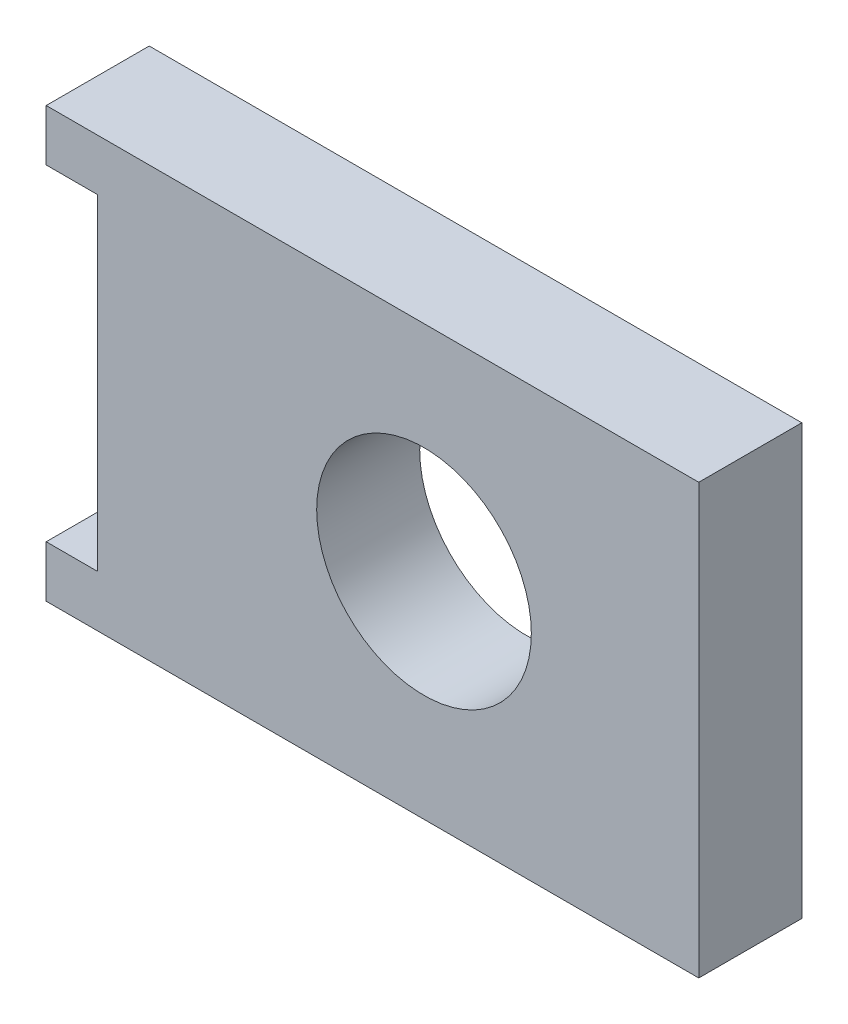
ISO-10303-21;
HEADER;
FILE_DESCRIPTION(('STEP AP214'),'2;1');
FILE_NAME('part.step','',(''),(''),'','','');
FILE_SCHEMA(('AUTOMOTIVE_DESIGN { 1 0 10303 214 1 1 1 1 }'));
ENDSEC;
DATA;
#1=APPLICATION_CONTEXT('core data for automotive mechanical design processes');
#2=APPLICATION_PROTOCOL_DEFINITION('international standard','automotive_design',2000,#1);
#3=PRODUCT_CONTEXT('',#1,'mechanical');
#4=PRODUCT('Part','Part','',(#3));
#5=PRODUCT_RELATED_PRODUCT_CATEGORY('part','',(#4));
#6=PRODUCT_DEFINITION_FORMATION('','',#4);
#7=PRODUCT_DEFINITION_CONTEXT('part definition',#1,'design');
#8=PRODUCT_DEFINITION('design','',#6,#7);
#9=PRODUCT_DEFINITION_SHAPE('','',#8);
#10=(LENGTH_UNIT() NAMED_UNIT(*) SI_UNIT(.MILLI.,.METRE.));
#11=(NAMED_UNIT(*) PLANE_ANGLE_UNIT() SI_UNIT($,.RADIAN.));
#12=(NAMED_UNIT(*) SI_UNIT($,.STERADIAN.) SOLID_ANGLE_UNIT());
#13=UNCERTAINTY_MEASURE_WITH_UNIT(LENGTH_MEASURE(1.E-05),#10,'distance_accuracy_value','');
#14=(GEOMETRIC_REPRESENTATION_CONTEXT(3) GLOBAL_UNCERTAINTY_ASSIGNED_CONTEXT((#13)) GLOBAL_UNIT_ASSIGNED_CONTEXT((#10,
#11,#12)) REPRESENTATION_CONTEXT('',''));
#15=CARTESIAN_POINT('',(0.,0.,0.));
#16=DIRECTION('',(0.,0.,1.));
#17=DIRECTION('',(1.,0.,0.));
#18=AXIS2_PLACEMENT_3D('',#15,#16,#17);
#19=CARTESIAN_POINT('',(0.,0.,6.));
#20=DIRECTION('',(0.,0.,1.));
#21=DIRECTION('',(1.,0.,0.));
#22=AXIS2_PLACEMENT_3D('',#19,#20,#21);
#23=PLANE('',#22);
#24=DIRECTION('',(0.,1.,0.));
#25=VECTOR('',#24,1.);
#26=CARTESIAN_POINT('',(16.,12.5,6.));
#27=LINE('',#26,#25);
#28=CARTESIAN_POINT('',(16.,-12.5,6.));
#29=VERTEX_POINT('',#28);
#30=CARTESIAN_POINT('',(16.,12.5,6.));
#31=VERTEX_POINT('',#30);
#32=EDGE_CURVE('E168',#29,#31,#27,.T.);
#33=ORIENTED_EDGE('',*,*,#32,.T.);
#34=DIRECTION('',(-1.,0.,0.));
#35=VECTOR('',#34,1.);
#36=CARTESIAN_POINT('',(-22.,12.5,6.));
#37=LINE('',#36,#35);
#38=CARTESIAN_POINT('',(-22.,12.5,6.));
#39=VERTEX_POINT('',#38);
#40=EDGE_CURVE('E104',#31,#39,#37,.T.);
#41=ORIENTED_EDGE('',*,*,#40,.T.);
#42=DIRECTION('',(0.,-1.,0.));
#43=VECTOR('',#42,1.);
#44=CARTESIAN_POINT('',(-22.,12.5,6.));
#45=LINE('',#44,#43);
#46=CARTESIAN_POINT('',(-22.,9.5,6.));
#47=VERTEX_POINT('',#46);
#48=EDGE_CURVE('E189',#39,#47,#45,.T.);
#49=ORIENTED_EDGE('',*,*,#48,.T.);
#50=DIRECTION('',(1.,0.,0.));
#51=VECTOR('',#50,1.);
#52=CARTESIAN_POINT('',(-22.,9.5,6.));
#53=LINE('',#52,#51);
#54=CARTESIAN_POINT('',(-19.,9.5,6.));
#55=VERTEX_POINT('',#54);
#56=EDGE_CURVE('E203',#47,#55,#53,.T.);
#57=ORIENTED_EDGE('',*,*,#56,.T.);
#58=DIRECTION('',(0.,-1.,0.));
#59=VECTOR('',#58,1.);
#60=CARTESIAN_POINT('',(-19.,9.5,6.));
#61=LINE('',#60,#59);
#62=CARTESIAN_POINT('',(-19.,-9.50000000000001,6.));
#63=VERTEX_POINT('',#62);
#64=EDGE_CURVE('E123',#55,#63,#61,.T.);
#65=ORIENTED_EDGE('',*,*,#64,.T.);
#66=DIRECTION('',(-1.,0.,0.));
#67=VECTOR('',#66,1.);
#68=CARTESIAN_POINT('',(-19.,-9.50000000000001,6.));
#69=LINE('',#68,#67);
#70=CARTESIAN_POINT('',(-22.,-9.50000000000001,6.));
#71=VERTEX_POINT('',#70);
#72=EDGE_CURVE('E117',#63,#71,#69,.T.);
#73=ORIENTED_EDGE('',*,*,#72,.T.);
#74=DIRECTION('',(0.,-1.,0.));
#75=VECTOR('',#74,1.);
#76=CARTESIAN_POINT('',(-22.,-9.50000000000001,6.));
#77=LINE('',#76,#75);
#78=CARTESIAN_POINT('',(-22.,-12.5,6.));
#79=VERTEX_POINT('',#78);
#80=EDGE_CURVE('E121',#71,#79,#77,.T.);
#81=ORIENTED_EDGE('',*,*,#80,.T.);
#82=DIRECTION('',(1.,0.,0.));
#83=VECTOR('',#82,1.);
#84=CARTESIAN_POINT('',(-22.,-12.5,6.));
#85=LINE('',#84,#83);
#86=EDGE_CURVE('E61',#79,#29,#85,.T.);
#87=ORIENTED_EDGE('',*,*,#86,.T.);
#88=EDGE_LOOP('',(#33,#41,#49,#57,#65,#73,#81,#87));
#89=FACE_BOUND('',#88,.T.);
#90=CARTESIAN_POINT('',(0.,0.,6.));
#91=DIRECTION('',(0.,0.,1.));
#92=DIRECTION('',(1.,0.,0.));
#93=AXIS2_PLACEMENT_3D('',#90,#91,#92);
#94=CIRCLE('',#93,6.25);
#95=CARTESIAN_POINT('',(6.25,0.,6.));
#96=VERTEX_POINT('',#95);
#97=EDGE_CURVE('E150',#96,#96,#94,.T.);
#98=ORIENTED_EDGE('',*,*,#97,.F.);
#99=EDGE_LOOP('',(#98));
#100=FACE_BOUND('',#99,.T.);
#101=ADVANCED_FACE('F43',(#89,#100),#23,.T.);
#102=CARTESIAN_POINT('',(0.,0.,0.));
#103=DIRECTION('',(0.,0.,1.));
#104=DIRECTION('',(1.,0.,0.));
#105=AXIS2_PLACEMENT_3D('',#102,#103,#104);
#106=PLANE('',#105);
#107=DIRECTION('',(0.,1.,0.));
#108=VECTOR('',#107,1.);
#109=CARTESIAN_POINT('',(16.,12.5,0.));
#110=LINE('',#109,#108);
#111=CARTESIAN_POINT('',(16.,-12.5,0.));
#112=VERTEX_POINT('',#111);
#113=CARTESIAN_POINT('',(16.,12.5,0.));
#114=VERTEX_POINT('',#113);
#115=EDGE_CURVE('E145',#112,#114,#110,.T.);
#116=ORIENTED_EDGE('',*,*,#115,.F.);
#117=DIRECTION('',(1.,0.,0.));
#118=VECTOR('',#117,1.);
#119=CARTESIAN_POINT('',(-22.,-12.5,0.));
#120=LINE('',#119,#118);
#121=CARTESIAN_POINT('',(-22.,-12.5,0.));
#122=VERTEX_POINT('',#121);
#123=EDGE_CURVE('E96',#122,#112,#120,.T.);
#124=ORIENTED_EDGE('',*,*,#123,.F.);
#125=DIRECTION('',(0.,-1.,0.));
#126=VECTOR('',#125,1.);
#127=CARTESIAN_POINT('',(-22.,-9.50000000000001,0.));
#128=LINE('',#127,#126);
#129=CARTESIAN_POINT('',(-22.,-9.50000000000001,0.));
#130=VERTEX_POINT('',#129);
#131=EDGE_CURVE('E90',#130,#122,#128,.T.);
#132=ORIENTED_EDGE('',*,*,#131,.F.);
#133=DIRECTION('',(-1.,0.,0.));
#134=VECTOR('',#133,1.);
#135=CARTESIAN_POINT('',(-19.,-9.50000000000001,0.));
#136=LINE('',#135,#134);
#137=CARTESIAN_POINT('',(-19.,-9.50000000000001,0.));
#138=VERTEX_POINT('',#137);
#139=EDGE_CURVE('E132',#138,#130,#136,.T.);
#140=ORIENTED_EDGE('',*,*,#139,.F.);
#141=DIRECTION('',(0.,-1.,0.));
#142=VECTOR('',#141,1.);
#143=CARTESIAN_POINT('',(-19.,9.5,0.));
#144=LINE('',#143,#142);
#145=CARTESIAN_POINT('',(-19.,9.5,0.));
#146=VERTEX_POINT('',#145);
#147=EDGE_CURVE('E159',#146,#138,#144,.T.);
#148=ORIENTED_EDGE('',*,*,#147,.F.);
#149=DIRECTION('',(1.,0.,0.));
#150=VECTOR('',#149,1.);
#151=CARTESIAN_POINT('',(-22.,9.5,0.));
#152=LINE('',#151,#150);
#153=CARTESIAN_POINT('',(-22.,9.5,0.));
#154=VERTEX_POINT('',#153);
#155=EDGE_CURVE('E156',#154,#146,#152,.T.);
#156=ORIENTED_EDGE('',*,*,#155,.F.);
#157=DIRECTION('',(0.,-1.,0.));
#158=VECTOR('',#157,1.);
#159=CARTESIAN_POINT('',(-22.,12.5,0.));
#160=LINE('',#159,#158);
#161=CARTESIAN_POINT('',(-22.,12.5,0.));
#162=VERTEX_POINT('',#161);
#163=EDGE_CURVE('E153',#162,#154,#160,.T.);
#164=ORIENTED_EDGE('',*,*,#163,.F.);
#165=DIRECTION('',(-1.,0.,0.));
#166=VECTOR('',#165,1.);
#167=CARTESIAN_POINT('',(-22.,12.5,0.));
#168=LINE('',#167,#166);
#169=EDGE_CURVE('E149',#114,#162,#168,.T.);
#170=ORIENTED_EDGE('',*,*,#169,.F.);
#171=EDGE_LOOP('',(#116,#124,#132,#140,#148,#156,#164,#170));
#172=FACE_BOUND('',#171,.T.);
#173=CARTESIAN_POINT('',(0.,0.,0.));
#174=DIRECTION('',(0.,0.,1.));
#175=DIRECTION('',(1.,0.,0.));
#176=AXIS2_PLACEMENT_3D('',#173,#174,#175);
#177=CIRCLE('',#176,6.25);
#178=CARTESIAN_POINT('',(6.25,0.,0.));
#179=VERTEX_POINT('',#178);
#180=EDGE_CURVE('E213',#179,#179,#177,.T.);
#181=ORIENTED_EDGE('',*,*,#180,.T.);
#182=EDGE_LOOP('',(#181));
#183=FACE_BOUND('',#182,.T.);
#184=ADVANCED_FACE('F193',(#172,#183),#106,.F.);
#185=CARTESIAN_POINT('',(16.,12.5,6.));
#186=DIRECTION('',(-1.,0.,0.));
#187=DIRECTION('',(0.,0.,1.));
#188=AXIS2_PLACEMENT_3D('',#185,#186,#187);
#189=PLANE('',#188);
#190=ORIENTED_EDGE('',*,*,#115,.T.);
#191=DIRECTION('',(0.,0.,-1.));
#192=VECTOR('',#191,1.);
#193=CARTESIAN_POINT('',(16.,12.5,6.));
#194=LINE('',#193,#192);
#195=EDGE_CURVE('E11',#31,#114,#194,.T.);
#196=ORIENTED_EDGE('',*,*,#195,.F.);
#197=ORIENTED_EDGE('',*,*,#32,.F.);
#198=DIRECTION('',(0.,0.,-1.));
#199=VECTOR('',#198,1.);
#200=CARTESIAN_POINT('',(16.,-12.5,6.));
#201=LINE('',#200,#199);
#202=EDGE_CURVE('E141',#29,#112,#201,.T.);
#203=ORIENTED_EDGE('',*,*,#202,.T.);
#204=EDGE_LOOP('',(#190,#196,#197,#203));
#205=FACE_BOUND('',#204,.T.);
#206=ADVANCED_FACE('F45',(#205),#189,.F.);
#207=CARTESIAN_POINT('',(-22.,12.5,6.));
#208=DIRECTION('',(0.,-1.,0.));
#209=DIRECTION('',(0.,0.,-1.));
#210=AXIS2_PLACEMENT_3D('',#207,#208,#209);
#211=PLANE('',#210);
#212=ORIENTED_EDGE('',*,*,#169,.T.);
#213=DIRECTION('',(0.,0.,-1.));
#214=VECTOR('',#213,1.);
#215=CARTESIAN_POINT('',(-22.,12.5,6.));
#216=LINE('',#215,#214);
#217=EDGE_CURVE('E53',#39,#162,#216,.T.);
#218=ORIENTED_EDGE('',*,*,#217,.F.);
#219=ORIENTED_EDGE('',*,*,#40,.F.);
#220=ORIENTED_EDGE('',*,*,#195,.T.);
#221=EDGE_LOOP('',(#212,#218,#219,#220));
#222=FACE_BOUND('',#221,.T.);
#223=ADVANCED_FACE('F243',(#222),#211,.F.);
#224=CARTESIAN_POINT('',(-22.,12.5,6.));
#225=DIRECTION('',(1.,0.,0.));
#226=DIRECTION('',(0.,1.,0.));
#227=AXIS2_PLACEMENT_3D('',#224,#225,#226);
#228=PLANE('',#227);
#229=ORIENTED_EDGE('',*,*,#163,.T.);
#230=DIRECTION('',(0.,0.,-1.));
#231=VECTOR('',#230,1.);
#232=CARTESIAN_POINT('',(-22.,9.5,6.));
#233=LINE('',#232,#231);
#234=EDGE_CURVE('E179',#47,#154,#233,.T.);
#235=ORIENTED_EDGE('',*,*,#234,.F.);
#236=ORIENTED_EDGE('',*,*,#48,.F.);
#237=ORIENTED_EDGE('',*,*,#217,.T.);
#238=EDGE_LOOP('',(#229,#235,#236,#237));
#239=FACE_BOUND('',#238,.T.);
#240=ADVANCED_FACE('F187',(#239),#228,.F.);
#241=CARTESIAN_POINT('',(-22.,9.5,6.));
#242=DIRECTION('',(0.,1.,0.));
#243=DIRECTION('',(0.,0.,1.));
#244=AXIS2_PLACEMENT_3D('',#241,#242,#243);
#245=PLANE('',#244);
#246=ORIENTED_EDGE('',*,*,#155,.T.);
#247=DIRECTION('',(0.,0.,-1.));
#248=VECTOR('',#247,1.);
#249=CARTESIAN_POINT('',(-19.,9.5,6.));
#250=LINE('',#249,#248);
#251=EDGE_CURVE('E175',#55,#146,#250,.T.);
#252=ORIENTED_EDGE('',*,*,#251,.F.);
#253=ORIENTED_EDGE('',*,*,#56,.F.);
#254=ORIENTED_EDGE('',*,*,#234,.T.);
#255=EDGE_LOOP('',(#246,#252,#253,#254));
#256=FACE_BOUND('',#255,.T.);
#257=ADVANCED_FACE('F198',(#256),#245,.F.);
#258=CARTESIAN_POINT('',(-19.,9.5,6.));
#259=DIRECTION('',(1.,0.,0.));
#260=DIRECTION('',(0.,1.,0.));
#261=AXIS2_PLACEMENT_3D('',#258,#259,#260);
#262=PLANE('',#261);
#263=ORIENTED_EDGE('',*,*,#147,.T.);
#264=DIRECTION('',(0.,0.,-1.));
#265=VECTOR('',#264,1.);
#266=CARTESIAN_POINT('',(-19.,-9.50000000000001,6.));
#267=LINE('',#266,#265);
#268=EDGE_CURVE('E134',#63,#138,#267,.T.);
#269=ORIENTED_EDGE('',*,*,#268,.F.);
#270=ORIENTED_EDGE('',*,*,#64,.F.);
#271=ORIENTED_EDGE('',*,*,#251,.T.);
#272=EDGE_LOOP('',(#263,#269,#270,#271));
#273=FACE_BOUND('',#272,.T.);
#274=ADVANCED_FACE('F201',(#273),#262,.F.);
#275=CARTESIAN_POINT('',(-19.,-9.50000000000001,6.));
#276=DIRECTION('',(0.,-1.,0.));
#277=DIRECTION('',(1.,0.,0.));
#278=AXIS2_PLACEMENT_3D('',#275,#276,#277);
#279=PLANE('',#278);
#280=ORIENTED_EDGE('',*,*,#139,.T.);
#281=DIRECTION('',(0.,0.,-1.));
#282=VECTOR('',#281,1.);
#283=CARTESIAN_POINT('',(-22.,-9.50000000000001,6.));
#284=LINE('',#283,#282);
#285=EDGE_CURVE('E129',#71,#130,#284,.T.);
#286=ORIENTED_EDGE('',*,*,#285,.F.);
#287=ORIENTED_EDGE('',*,*,#72,.F.);
#288=ORIENTED_EDGE('',*,*,#268,.T.);
#289=EDGE_LOOP('',(#280,#286,#287,#288));
#290=FACE_BOUND('',#289,.T.);
#291=ADVANCED_FACE('F130',(#290),#279,.F.);
#292=CARTESIAN_POINT('',(-22.,-9.50000000000001,6.));
#293=DIRECTION('',(1.,0.,0.));
#294=DIRECTION('',(0.,0.,-1.));
#295=AXIS2_PLACEMENT_3D('',#292,#293,#294);
#296=PLANE('',#295);
#297=ORIENTED_EDGE('',*,*,#131,.T.);
#298=DIRECTION('',(0.,0.,-1.));
#299=VECTOR('',#298,1.);
#300=CARTESIAN_POINT('',(-22.,-12.5,6.));
#301=LINE('',#300,#299);
#302=EDGE_CURVE('E135',#79,#122,#301,.T.);
#303=ORIENTED_EDGE('',*,*,#302,.F.);
#304=ORIENTED_EDGE('',*,*,#80,.F.);
#305=ORIENTED_EDGE('',*,*,#285,.T.);
#306=EDGE_LOOP('',(#297,#303,#304,#305));
#307=FACE_BOUND('',#306,.T.);
#308=ADVANCED_FACE('F137',(#307),#296,.F.);
#309=CARTESIAN_POINT('',(-22.,-12.5,6.));
#310=DIRECTION('',(0.,1.,0.));
#311=DIRECTION('',(0.,0.,1.));
#312=AXIS2_PLACEMENT_3D('',#309,#310,#311);
#313=PLANE('',#312);
#314=ORIENTED_EDGE('',*,*,#123,.T.);
#315=ORIENTED_EDGE('',*,*,#202,.F.);
#316=ORIENTED_EDGE('',*,*,#86,.F.);
#317=ORIENTED_EDGE('',*,*,#302,.T.);
#318=EDGE_LOOP('',(#314,#315,#316,#317));
#319=FACE_BOUND('',#318,.T.);
#320=ADVANCED_FACE('F231',(#319),#313,.F.);
#321=CARTESIAN_POINT('',(0.,0.,6.));
#322=DIRECTION('',(0.,0.,-1.));
#323=DIRECTION('',(-1.,0.,0.));
#324=AXIS2_PLACEMENT_3D('',#321,#322,#323);
#325=CYLINDRICAL_SURFACE('',#324,6.25);
#326=ORIENTED_EDGE('',*,*,#97,.T.);
#327=EDGE_LOOP('',(#326));
#328=FACE_BOUND('',#327,.T.);
#329=ORIENTED_EDGE('',*,*,#180,.F.);
#330=EDGE_LOOP('',(#329));
#331=FACE_BOUND('',#330,.T.);
#332=ADVANCED_FACE('F221',(#328,#331),#325,.F.);
#333=CLOSED_SHELL('',(#101,#184,#206,#223,#240,#257,#274,#291,#308,#320,#332));
#334=MANIFOLD_SOLID_BREP('B2',#333);
#335=ADVANCED_BREP_SHAPE_REPRESENTATION('',(#18,#334),#14);
#336=SHAPE_DEFINITION_REPRESENTATION(#9,#335);
ENDSEC;
END-ISO-10303-21;
